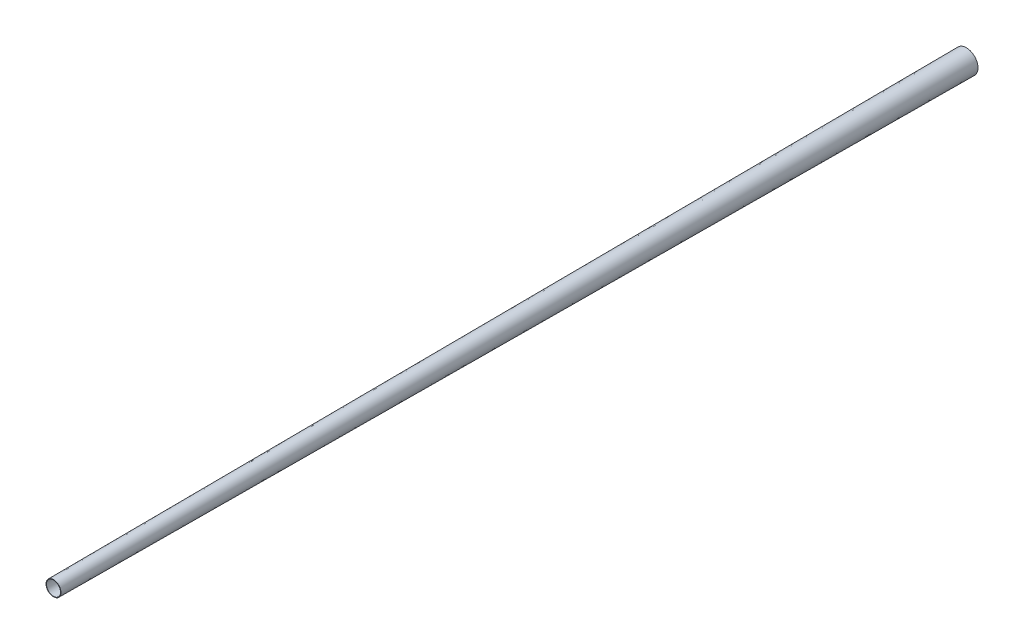
ISO-10303-21;
HEADER;
FILE_DESCRIPTION(('STEP AP214'),'2;1');
FILE_NAME('part.step','',(''),(''),'','','');
FILE_SCHEMA(('AUTOMOTIVE_DESIGN { 1 0 10303 214 1 1 1 1 }'));
ENDSEC;
DATA;
#1=APPLICATION_CONTEXT('core data for automotive mechanical design processes');
#2=APPLICATION_PROTOCOL_DEFINITION('international standard','automotive_design',2000,#1);
#3=PRODUCT_CONTEXT('',#1,'mechanical');
#4=PRODUCT('Part','Part','',(#3));
#5=PRODUCT_RELATED_PRODUCT_CATEGORY('part','',(#4));
#6=PRODUCT_DEFINITION_FORMATION('','',#4);
#7=PRODUCT_DEFINITION_CONTEXT('part definition',#1,'design');
#8=PRODUCT_DEFINITION('design','',#6,#7);
#9=PRODUCT_DEFINITION_SHAPE('','',#8);
#10=(LENGTH_UNIT() NAMED_UNIT(*) SI_UNIT(.MILLI.,.METRE.));
#11=(NAMED_UNIT(*) PLANE_ANGLE_UNIT() SI_UNIT($,.RADIAN.));
#12=(NAMED_UNIT(*) SI_UNIT($,.STERADIAN.) SOLID_ANGLE_UNIT());
#13=UNCERTAINTY_MEASURE_WITH_UNIT(LENGTH_MEASURE(1.E-05),#10,'distance_accuracy_value','');
#14=(GEOMETRIC_REPRESENTATION_CONTEXT(3) GLOBAL_UNCERTAINTY_ASSIGNED_CONTEXT((#13)) GLOBAL_UNIT_ASSIGNED_CONTEXT((#10,
#11,#12)) REPRESENTATION_CONTEXT('',''));
#15=CARTESIAN_POINT('',(0.,0.,0.));
#16=DIRECTION('',(0.,0.,1.));
#17=DIRECTION('',(1.,0.,0.));
#18=AXIS2_PLACEMENT_3D('',#15,#16,#17);
#19=CARTESIAN_POINT('',(0.,0.,0.));
#20=DIRECTION('',(0.,0.,1.));
#21=DIRECTION('',(1.,0.,0.));
#22=AXIS2_PLACEMENT_3D('',#19,#20,#21);
#23=PLANE('',#22);
#24=CARTESIAN_POINT('',(0.,0.,0.));
#25=DIRECTION('',(0.,0.,1.));
#26=DIRECTION('',(1.,0.,0.));
#27=AXIS2_PLACEMENT_3D('',#24,#25,#26);
#28=CIRCLE('',#27,13.2080052633722);
#29=CARTESIAN_POINT('',(13.2080052633722,0.,0.));
#30=VERTEX_POINT('',#29);
#31=EDGE_CURVE('E39',#30,#30,#28,.T.);
#32=ORIENTED_EDGE('',*,*,#31,.F.);
#33=EDGE_LOOP('',(#32));
#34=FACE_BOUND('',#33,.T.);
#35=CARTESIAN_POINT('',(0.,0.,0.));
#36=DIRECTION('',(0.,0.,1.));
#37=DIRECTION('',(1.,0.,0.));
#38=AXIS2_PLACEMENT_3D('',#35,#36,#37);
#39=CIRCLE('',#38,12.7000000000002);
#40=CARTESIAN_POINT('',(12.7000000000002,0.,0.));
#41=VERTEX_POINT('',#40);
#42=EDGE_CURVE('E48',#41,#41,#39,.T.);
#43=ORIENTED_EDGE('',*,*,#42,.T.);
#44=EDGE_LOOP('',(#43));
#45=FACE_BOUND('',#44,.T.);
#46=ADVANCED_FACE('F35',(#34,#45),#23,.F.);
#47=CARTESIAN_POINT('',(0.,0.,1035.05));
#48=DIRECTION('',(0.,0.,1.));
#49=DIRECTION('',(1.,0.,0.));
#50=AXIS2_PLACEMENT_3D('',#47,#48,#49);
#51=PLANE('',#50);
#52=CARTESIAN_POINT('',(0.,0.,1035.05));
#53=DIRECTION('',(0.,0.,1.));
#54=DIRECTION('',(1.,0.,0.));
#55=AXIS2_PLACEMENT_3D('',#52,#53,#54);
#56=CIRCLE('',#55,7.98830000000006);
#57=CARTESIAN_POINT('',(7.98830000000006,0.,1035.05));
#58=VERTEX_POINT('',#57);
#59=EDGE_CURVE('E46',#58,#58,#56,.T.);
#60=ORIENTED_EDGE('',*,*,#59,.F.);
#61=EDGE_LOOP('',(#60));
#62=FACE_BOUND('',#61,.T.);
#63=CARTESIAN_POINT('',(0.,0.,1035.05));
#64=DIRECTION('',(0.,0.,1.));
#65=DIRECTION('',(1.,0.,0.));
#66=AXIS2_PLACEMENT_3D('',#63,#64,#65);
#67=CIRCLE('',#66,8.49630526337209);
#68=CARTESIAN_POINT('',(8.49630526337209,0.,1035.05));
#69=VERTEX_POINT('',#68);
#70=EDGE_CURVE('E11',#69,#69,#67,.T.);
#71=ORIENTED_EDGE('',*,*,#70,.T.);
#72=EDGE_LOOP('',(#71));
#73=FACE_BOUND('',#72,.T.);
#74=ADVANCED_FACE('F57',(#62,#73),#51,.T.);
#75=CARTESIAN_POINT('',(0.,0.,1035.05231246684));
#76=DIRECTION('',(0.,0.,-1.));
#77=DIRECTION('',(-1.,0.,0.));
#78=AXIS2_PLACEMENT_3D('',#75,#76,#77);
#79=CONICAL_SURFACE('',#78,8.49629473668256,0.00455211579638896);
#80=ORIENTED_EDGE('',*,*,#70,.F.);
#81=EDGE_LOOP('',(#80));
#82=FACE_BOUND('',#81,.T.);
#83=ORIENTED_EDGE('',*,*,#31,.T.);
#84=EDGE_LOOP('',(#83));
#85=FACE_BOUND('',#84,.T.);
#86=ADVANCED_FACE('F37',(#82,#85),#79,.T.);
#87=CARTESIAN_POINT('',(0.,0.,1035.05));
#88=DIRECTION('',(0.,0.,-1.));
#89=DIRECTION('',(-1.,0.,0.));
#90=AXIS2_PLACEMENT_3D('',#87,#88,#89);
#91=CONICAL_SURFACE('',#90,7.98830000000006,0.00455211579638896);
#92=ORIENTED_EDGE('',*,*,#59,.T.);
#93=EDGE_LOOP('',(#92));
#94=FACE_BOUND('',#93,.T.);
#95=ORIENTED_EDGE('',*,*,#42,.F.);
#96=EDGE_LOOP('',(#95));
#97=FACE_BOUND('',#96,.T.);
#98=ADVANCED_FACE('F54',(#94,#97),#91,.F.);
#99=CLOSED_SHELL('',(#46,#74,#86,#98));
#100=MANIFOLD_SOLID_BREP('B2',#99);
#101=ADVANCED_BREP_SHAPE_REPRESENTATION('',(#18,#100),#14);
#102=SHAPE_DEFINITION_REPRESENTATION(#9,#101);
ENDSEC;
END-ISO-10303-21;
